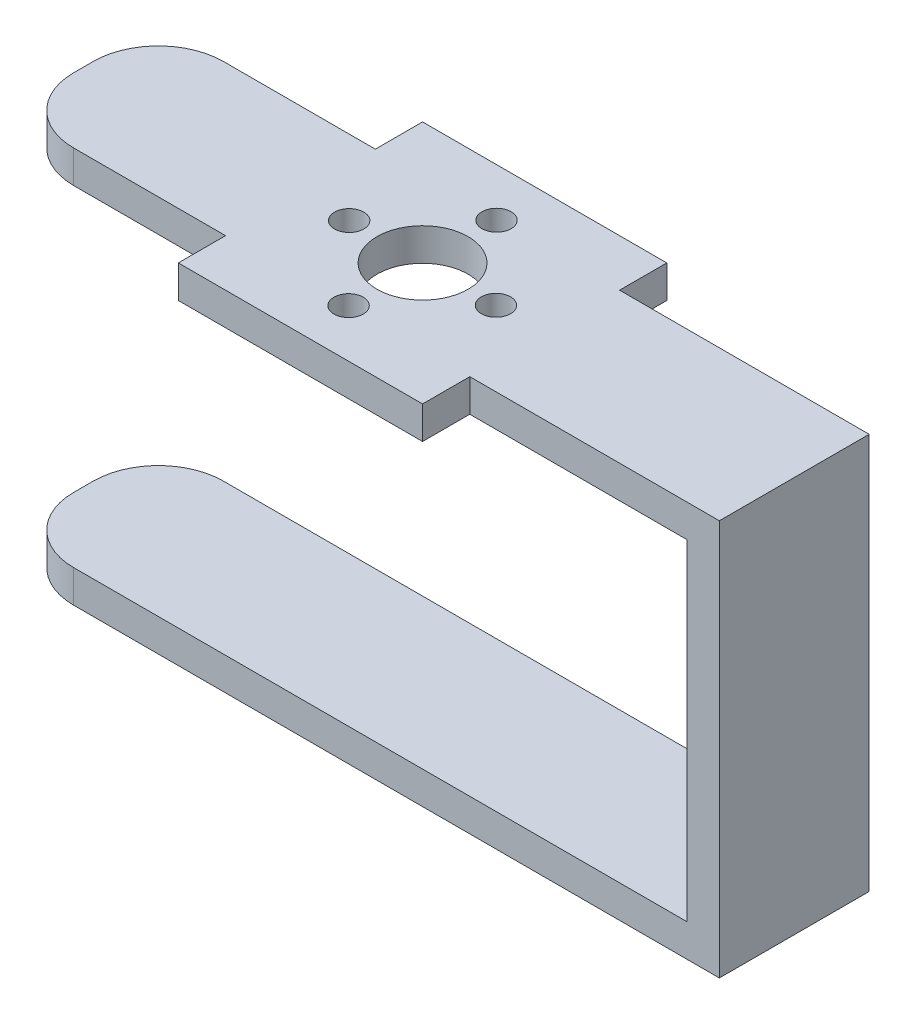
ISO-10303-21;
HEADER;
FILE_DESCRIPTION(('STEP AP214'),'2;1');
FILE_NAME('part.step','',(''),(''),'','','');
FILE_SCHEMA(('AUTOMOTIVE_DESIGN { 1 0 10303 214 1 1 1 1 }'));
ENDSEC;
DATA;
#1=APPLICATION_CONTEXT('core data for automotive mechanical design processes');
#2=APPLICATION_PROTOCOL_DEFINITION('international standard','automotive_design',2000,#1);
#3=PRODUCT_CONTEXT('',#1,'mechanical');
#4=PRODUCT('Part','Part','',(#3));
#5=PRODUCT_RELATED_PRODUCT_CATEGORY('part','',(#4));
#6=PRODUCT_DEFINITION_FORMATION('','',#4);
#7=PRODUCT_DEFINITION_CONTEXT('part definition',#1,'design');
#8=PRODUCT_DEFINITION('design','',#6,#7);
#9=PRODUCT_DEFINITION_SHAPE('','',#8);
#10=(LENGTH_UNIT() NAMED_UNIT(*) SI_UNIT(.MILLI.,.METRE.));
#11=(NAMED_UNIT(*) PLANE_ANGLE_UNIT() SI_UNIT($,.RADIAN.));
#12=(NAMED_UNIT(*) SI_UNIT($,.STERADIAN.) SOLID_ANGLE_UNIT());
#13=UNCERTAINTY_MEASURE_WITH_UNIT(LENGTH_MEASURE(1.E-05),#10,'distance_accuracy_value','');
#14=(GEOMETRIC_REPRESENTATION_CONTEXT(3) GLOBAL_UNCERTAINTY_ASSIGNED_CONTEXT((#13)) GLOBAL_UNIT_ASSIGNED_CONTEXT((#10,
#11,#12)) REPRESENTATION_CONTEXT('',''));
#15=CARTESIAN_POINT('',(0.,0.,0.));
#16=DIRECTION('',(0.,0.,1.));
#17=DIRECTION('',(1.,0.,0.));
#18=AXIS2_PLACEMENT_3D('',#15,#16,#17);
#19=CARTESIAN_POINT('',(52.07,-60.8,0.));
#20=DIRECTION('',(-1.,0.,0.));
#21=DIRECTION('',(0.,0.,1.));
#22=AXIS2_PLACEMENT_3D('',#19,#20,#21);
#23=PLANE('',#22);
#24=DIRECTION('',(0.,1.,0.));
#25=VECTOR('',#24,1.);
#26=CARTESIAN_POINT('',(52.07,-60.8,-11.5));
#27=LINE('',#26,#25);
#28=CARTESIAN_POINT('',(52.07,-55.8,-11.5));
#29=VERTEX_POINT('',#28);
#30=CARTESIAN_POINT('',(52.07,-5.00000000000001,-11.5));
#31=VERTEX_POINT('',#30);
#32=EDGE_CURVE('E194',#29,#31,#27,.T.);
#33=ORIENTED_EDGE('',*,*,#32,.F.);
#34=DIRECTION('',(0.,0.,1.));
#35=VECTOR('',#34,1.);
#36=CARTESIAN_POINT('',(52.07,-55.8,0.));
#37=LINE('',#36,#35);
#38=CARTESIAN_POINT('',(52.07,-55.8,11.5));
#39=VERTEX_POINT('',#38);
#40=EDGE_CURVE('E200',#29,#39,#37,.T.);
#41=ORIENTED_EDGE('',*,*,#40,.T.);
#42=DIRECTION('',(0.,1.,0.));
#43=VECTOR('',#42,1.);
#44=CARTESIAN_POINT('',(52.07,-60.8,11.5));
#45=LINE('',#44,#43);
#46=CARTESIAN_POINT('',(52.07,-5.,11.5));
#47=VERTEX_POINT('',#46);
#48=EDGE_CURVE('E207',#39,#47,#45,.T.);
#49=ORIENTED_EDGE('',*,*,#48,.T.);
#50=DIRECTION('',(0.,0.,1.));
#51=VECTOR('',#50,1.);
#52=CARTESIAN_POINT('',(52.07,-5.,0.));
#53=LINE('',#52,#51);
#54=EDGE_CURVE('E210',#31,#47,#53,.T.);
#55=ORIENTED_EDGE('',*,*,#54,.F.);
#56=EDGE_LOOP('',(#33,#41,#49,#55));
#57=FACE_BOUND('',#56,.T.);
#58=ADVANCED_FACE('F35',(#57),#23,.T.);
#59=CARTESIAN_POINT('',(0.,-5.,11.5));
#60=DIRECTION('',(0.,0.,1.));
#61=DIRECTION('',(1.,0.,0.));
#62=AXIS2_PLACEMENT_3D('',#59,#60,#61);
#63=PLANE('',#62);
#64=DIRECTION('',(-1.,0.,0.));
#65=VECTOR('',#64,1.);
#66=CARTESIAN_POINT('',(57.07,-55.8,11.5));
#67=LINE('',#66,#65);
#68=CARTESIAN_POINT('',(-42.07,-55.8,11.5));
#69=VERTEX_POINT('',#68);
#70=EDGE_CURVE('E406',#39,#69,#67,.T.);
#71=ORIENTED_EDGE('',*,*,#70,.T.);
#72=DIRECTION('',(0.,-1.,0.));
#73=VECTOR('',#72,1.);
#74=CARTESIAN_POINT('',(-42.07,-5.,11.5));
#75=LINE('',#74,#73);
#76=CARTESIAN_POINT('',(-42.07,-60.8,11.5));
#77=VERTEX_POINT('',#76);
#78=EDGE_CURVE('E328',#69,#77,#75,.T.);
#79=ORIENTED_EDGE('',*,*,#78,.T.);
#80=DIRECTION('',(1.,0.,0.));
#81=VECTOR('',#80,1.);
#82=CARTESIAN_POINT('',(0.,-60.8,11.5));
#83=LINE('',#82,#81);
#84=CARTESIAN_POINT('',(57.07,-60.8,11.5));
#85=VERTEX_POINT('',#84);
#86=EDGE_CURVE('E184',#77,#85,#83,.T.);
#87=ORIENTED_EDGE('',*,*,#86,.T.);
#88=DIRECTION('',(0.,1.,0.));
#89=VECTOR('',#88,1.);
#90=CARTESIAN_POINT('',(57.07,-60.8,11.5));
#91=LINE('',#90,#89);
#92=CARTESIAN_POINT('',(57.07,0.,11.5));
#93=VERTEX_POINT('',#92);
#94=EDGE_CURVE('E197',#85,#93,#91,.T.);
#95=ORIENTED_EDGE('',*,*,#94,.T.);
#96=DIRECTION('',(1.,0.,0.));
#97=VECTOR('',#96,1.);
#98=CARTESIAN_POINT('',(0.,0.,11.5));
#99=LINE('',#98,#97);
#100=CARTESIAN_POINT('',(18.75,0.,11.5));
#101=VERTEX_POINT('',#100);
#102=EDGE_CURVE('E277',#101,#93,#99,.T.);
#103=ORIENTED_EDGE('',*,*,#102,.F.);
#104=DIRECTION('',(0.,1.,0.));
#105=VECTOR('',#104,1.);
#106=CARTESIAN_POINT('',(18.75,-5.,11.5));
#107=LINE('',#106,#105);
#108=CARTESIAN_POINT('',(18.75,-5.,11.5));
#109=VERTEX_POINT('',#108);
#110=EDGE_CURVE('E294',#109,#101,#107,.T.);
#111=ORIENTED_EDGE('',*,*,#110,.F.);
#112=DIRECTION('',(1.,0.,0.));
#113=VECTOR('',#112,1.);
#114=CARTESIAN_POINT('',(0.,-5.,11.5));
#115=LINE('',#114,#113);
#116=EDGE_CURVE('E236',#109,#47,#115,.T.);
#117=ORIENTED_EDGE('',*,*,#116,.T.);
#118=ORIENTED_EDGE('',*,*,#48,.F.);
#119=EDGE_LOOP('',(#71,#79,#87,#95,#103,#111,#117,#118));
#120=FACE_BOUND('',#119,.T.);
#121=ADVANCED_FACE('F385',(#120),#63,.T.);
#122=CARTESIAN_POINT('',(18.75,-5.,0.));
#123=DIRECTION('',(1.,0.,0.));
#124=DIRECTION('',(0.,0.,-1.));
#125=AXIS2_PLACEMENT_3D('',#122,#123,#124);
#126=PLANE('',#125);
#127=DIRECTION('',(0.,0.,-1.));
#128=VECTOR('',#127,1.);
#129=CARTESIAN_POINT('',(18.75,0.,0.));
#130=LINE('',#129,#128);
#131=CARTESIAN_POINT('',(18.75,0.,18.75));
#132=VERTEX_POINT('',#131);
#133=EDGE_CURVE('E260',#132,#101,#130,.T.);
#134=ORIENTED_EDGE('',*,*,#133,.F.);
#135=DIRECTION('',(0.,1.,0.));
#136=VECTOR('',#135,1.);
#137=CARTESIAN_POINT('',(18.75,-5.,18.75));
#138=LINE('',#137,#136);
#139=CARTESIAN_POINT('',(18.75,-5.,18.75));
#140=VERTEX_POINT('',#139);
#141=EDGE_CURVE('E297',#140,#132,#138,.T.);
#142=ORIENTED_EDGE('',*,*,#141,.F.);
#143=DIRECTION('',(0.,0.,-1.));
#144=VECTOR('',#143,1.);
#145=CARTESIAN_POINT('',(18.75,-5.,0.));
#146=LINE('',#145,#144);
#147=EDGE_CURVE('E221',#140,#109,#146,.T.);
#148=ORIENTED_EDGE('',*,*,#147,.T.);
#149=ORIENTED_EDGE('',*,*,#110,.T.);
#150=EDGE_LOOP('',(#134,#142,#148,#149));
#151=FACE_BOUND('',#150,.T.);
#152=ADVANCED_FACE('F378',(#151),#126,.T.);
#153=CARTESIAN_POINT('',(0.,-5.,18.75));
#154=DIRECTION('',(0.,0.,-1.));
#155=DIRECTION('',(-1.,0.,0.));
#156=AXIS2_PLACEMENT_3D('',#153,#154,#155);
#157=PLANE('',#156);
#158=DIRECTION('',(-1.,0.,0.));
#159=VECTOR('',#158,1.);
#160=CARTESIAN_POINT('',(0.,0.,18.75));
#161=LINE('',#160,#159);
#162=CARTESIAN_POINT('',(-18.75,0.,18.75));
#163=VERTEX_POINT('',#162);
#164=EDGE_CURVE('E275',#132,#163,#161,.T.);
#165=ORIENTED_EDGE('',*,*,#164,.T.);
#166=DIRECTION('',(0.,1.,0.));
#167=VECTOR('',#166,1.);
#168=CARTESIAN_POINT('',(-18.75,-5.,18.75));
#169=LINE('',#168,#167);
#170=CARTESIAN_POINT('',(-18.75,-5.,18.75));
#171=VERTEX_POINT('',#170);
#172=EDGE_CURVE('E299',#171,#163,#169,.T.);
#173=ORIENTED_EDGE('',*,*,#172,.F.);
#174=DIRECTION('',(-1.,0.,0.));
#175=VECTOR('',#174,1.);
#176=CARTESIAN_POINT('',(0.,-5.,18.75));
#177=LINE('',#176,#175);
#178=EDGE_CURVE('E234',#140,#171,#177,.T.);
#179=ORIENTED_EDGE('',*,*,#178,.F.);
#180=ORIENTED_EDGE('',*,*,#141,.T.);
#181=EDGE_LOOP('',(#165,#173,#179,#180));
#182=FACE_BOUND('',#181,.T.);
#183=ADVANCED_FACE('F474',(#182),#157,.F.);
#184=CARTESIAN_POINT('',(-18.75,-5.,0.));
#185=DIRECTION('',(1.,0.,0.));
#186=DIRECTION('',(0.,0.,-1.));
#187=AXIS2_PLACEMENT_3D('',#184,#185,#186);
#188=PLANE('',#187);
#189=DIRECTION('',(0.,0.,-1.));
#190=VECTOR('',#189,1.);
#191=CARTESIAN_POINT('',(-18.75,0.,0.));
#192=LINE('',#191,#190);
#193=CARTESIAN_POINT('',(-18.75,0.,11.5));
#194=VERTEX_POINT('',#193);
#195=EDGE_CURVE('E267',#163,#194,#192,.T.);
#196=ORIENTED_EDGE('',*,*,#195,.T.);
#197=DIRECTION('',(0.,1.,0.));
#198=VECTOR('',#197,1.);
#199=CARTESIAN_POINT('',(-18.75,-5.,11.5));
#200=LINE('',#199,#198);
#201=CARTESIAN_POINT('',(-18.75,-5.,11.5));
#202=VERTEX_POINT('',#201);
#203=EDGE_CURVE('E302',#202,#194,#200,.T.);
#204=ORIENTED_EDGE('',*,*,#203,.F.);
#205=DIRECTION('',(0.,0.,-1.));
#206=VECTOR('',#205,1.);
#207=CARTESIAN_POINT('',(-18.75,-5.,0.));
#208=LINE('',#207,#206);
#209=EDGE_CURVE('E227',#171,#202,#208,.T.);
#210=ORIENTED_EDGE('',*,*,#209,.F.);
#211=ORIENTED_EDGE('',*,*,#172,.T.);
#212=EDGE_LOOP('',(#196,#204,#210,#211));
#213=FACE_BOUND('',#212,.T.);
#214=ADVANCED_FACE('F370',(#213),#188,.F.);
#215=CARTESIAN_POINT('',(0.,-5.,11.5));
#216=DIRECTION('',(0.,0.,-1.));
#217=DIRECTION('',(-1.,0.,0.));
#218=AXIS2_PLACEMENT_3D('',#215,#216,#217);
#219=PLANE('',#218);
#220=DIRECTION('',(-1.,0.,0.));
#221=VECTOR('',#220,1.);
#222=CARTESIAN_POINT('',(0.,0.,11.5));
#223=LINE('',#222,#221);
#224=CARTESIAN_POINT('',(-42.07,0.,11.5));
#225=VERTEX_POINT('',#224);
#226=EDGE_CURVE('E273',#194,#225,#223,.T.);
#227=ORIENTED_EDGE('',*,*,#226,.T.);
#228=DIRECTION('',(0.,1.,0.));
#229=VECTOR('',#228,1.);
#230=CARTESIAN_POINT('',(-42.07,-5.,11.5));
#231=LINE('',#230,#229);
#232=CARTESIAN_POINT('',(-42.07,-5.,11.5));
#233=VERTEX_POINT('',#232);
#234=EDGE_CURVE('E11',#225,#233,#231,.F.);
#235=ORIENTED_EDGE('',*,*,#234,.T.);
#236=DIRECTION('',(-1.,0.,0.));
#237=VECTOR('',#236,1.);
#238=CARTESIAN_POINT('',(0.,-5.,11.5));
#239=LINE('',#238,#237);
#240=EDGE_CURVE('E232',#202,#233,#239,.T.);
#241=ORIENTED_EDGE('',*,*,#240,.F.);
#242=ORIENTED_EDGE('',*,*,#203,.T.);
#243=EDGE_LOOP('',(#227,#235,#241,#242));
#244=FACE_BOUND('',#243,.T.);
#245=ADVANCED_FACE('F366',(#244),#219,.F.);
#246=CARTESIAN_POINT('',(-52.07,-5.,0.));
#247=DIRECTION('',(-1.,0.,0.));
#248=DIRECTION('',(0.,0.,1.));
#249=AXIS2_PLACEMENT_3D('',#246,#247,#248);
#250=PLANE('',#249);
#251=DIRECTION('',(0.,0.,1.));
#252=VECTOR('',#251,1.);
#253=CARTESIAN_POINT('',(-52.07,0.,0.));
#254=LINE('',#253,#252);
#255=CARTESIAN_POINT('',(-52.07,0.,-1.49999999999999));
#256=VERTEX_POINT('',#255);
#257=CARTESIAN_POINT('',(-52.07,0.,1.49999999999999));
#258=VERTEX_POINT('',#257);
#259=EDGE_CURVE('E270',#256,#258,#254,.T.);
#260=ORIENTED_EDGE('',*,*,#259,.F.);
#261=DIRECTION('',(0.,1.,0.));
#262=VECTOR('',#261,1.);
#263=CARTESIAN_POINT('',(-52.07,-5.,-1.49999999999999));
#264=LINE('',#263,#262);
#265=CARTESIAN_POINT('',(-52.07,-5.,-1.49999999999999));
#266=VERTEX_POINT('',#265);
#267=EDGE_CURVE('E341',#256,#266,#264,.F.);
#268=ORIENTED_EDGE('',*,*,#267,.T.);
#269=DIRECTION('',(0.,0.,1.));
#270=VECTOR('',#269,1.);
#271=CARTESIAN_POINT('',(-52.07,-5.,0.));
#272=LINE('',#271,#270);
#273=CARTESIAN_POINT('',(-52.07,-5.,1.49999999999999));
#274=VERTEX_POINT('',#273);
#275=EDGE_CURVE('E230',#266,#274,#272,.T.);
#276=ORIENTED_EDGE('',*,*,#275,.T.);
#277=DIRECTION('',(0.,1.,0.));
#278=VECTOR('',#277,1.);
#279=CARTESIAN_POINT('',(-52.07,0.,1.49999999999999));
#280=LINE('',#279,#278);
#281=EDGE_CURVE('E338',#274,#258,#280,.T.);
#282=ORIENTED_EDGE('',*,*,#281,.T.);
#283=EDGE_LOOP('',(#260,#268,#276,#282));
#284=FACE_BOUND('',#283,.T.);
#285=ADVANCED_FACE('F361',(#284),#250,.T.);
#286=CARTESIAN_POINT('',(0.,-5.,-11.5));
#287=DIRECTION('',(0.,0.,-1.));
#288=DIRECTION('',(-1.,0.,0.));
#289=AXIS2_PLACEMENT_3D('',#286,#287,#288);
#290=PLANE('',#289);
#291=DIRECTION('',(-1.,0.,0.));
#292=VECTOR('',#291,1.);
#293=CARTESIAN_POINT('',(0.,-5.,-11.5));
#294=LINE('',#293,#292);
#295=CARTESIAN_POINT('',(-18.75,-5.,-11.5));
#296=VERTEX_POINT('',#295);
#297=CARTESIAN_POINT('',(-42.07,-5.,-11.5));
#298=VERTEX_POINT('',#297);
#299=EDGE_CURVE('E226',#296,#298,#294,.T.);
#300=ORIENTED_EDGE('',*,*,#299,.T.);
#301=DIRECTION('',(0.,1.,0.));
#302=VECTOR('',#301,1.);
#303=CARTESIAN_POINT('',(-42.07,-5.,-11.5));
#304=LINE('',#303,#302);
#305=CARTESIAN_POINT('',(-42.07,0.,-11.5));
#306=VERTEX_POINT('',#305);
#307=EDGE_CURVE('E331',#298,#306,#304,.T.);
#308=ORIENTED_EDGE('',*,*,#307,.T.);
#309=DIRECTION('',(-1.,0.,0.));
#310=VECTOR('',#309,1.);
#311=CARTESIAN_POINT('',(0.,0.,-11.5));
#312=LINE('',#311,#310);
#313=CARTESIAN_POINT('',(-18.75,0.,-11.5));
#314=VERTEX_POINT('',#313);
#315=EDGE_CURVE('E266',#314,#306,#312,.T.);
#316=ORIENTED_EDGE('',*,*,#315,.F.);
#317=DIRECTION('',(0.,1.,0.));
#318=VECTOR('',#317,1.);
#319=CARTESIAN_POINT('',(-18.75,-5.,-11.5));
#320=LINE('',#319,#318);
#321=EDGE_CURVE('E305',#296,#314,#320,.T.);
#322=ORIENTED_EDGE('',*,*,#321,.F.);
#323=EDGE_LOOP('',(#300,#308,#316,#322));
#324=FACE_BOUND('',#323,.T.);
#325=ADVANCED_FACE('F351',(#324),#290,.T.);
#326=CARTESIAN_POINT('',(-18.75,0.,-18.75));
#327=VERTEX_POINT('',#326);
#328=EDGE_CURVE('E263',#314,#327,#192,.T.);
#329=ORIENTED_EDGE('',*,*,#328,.T.);
#330=DIRECTION('',(0.,1.,0.));
#331=VECTOR('',#330,1.);
#332=CARTESIAN_POINT('',(-18.75,-5.,-18.75));
#333=LINE('',#332,#331);
#334=CARTESIAN_POINT('',(-18.75,-5.,-18.75));
#335=VERTEX_POINT('',#334);
#336=EDGE_CURVE('E307',#335,#327,#333,.T.);
#337=ORIENTED_EDGE('',*,*,#336,.F.);
#338=EDGE_CURVE('E224',#296,#335,#208,.T.);
#339=ORIENTED_EDGE('',*,*,#338,.F.);
#340=ORIENTED_EDGE('',*,*,#321,.T.);
#341=EDGE_LOOP('',(#329,#337,#339,#340));
#342=FACE_BOUND('',#341,.T.);
#343=ADVANCED_FACE('F398',(#342),#188,.F.);
#344=CARTESIAN_POINT('',(0.,-5.,-18.75));
#345=DIRECTION('',(0.,0.,-1.));
#346=DIRECTION('',(-1.,0.,0.));
#347=AXIS2_PLACEMENT_3D('',#344,#345,#346);
#348=PLANE('',#347);
#349=DIRECTION('',(-1.,0.,0.));
#350=VECTOR('',#349,1.);
#351=CARTESIAN_POINT('',(0.,0.,-18.75));
#352=LINE('',#351,#350);
#353=CARTESIAN_POINT('',(18.75,0.,-18.75));
#354=VERTEX_POINT('',#353);
#355=EDGE_CURVE('E259',#354,#327,#352,.T.);
#356=ORIENTED_EDGE('',*,*,#355,.F.);
#357=DIRECTION('',(0.,1.,0.));
#358=VECTOR('',#357,1.);
#359=CARTESIAN_POINT('',(18.75,-5.,-18.75));
#360=LINE('',#359,#358);
#361=CARTESIAN_POINT('',(18.75,-5.,-18.75));
#362=VERTEX_POINT('',#361);
#363=EDGE_CURVE('E309',#362,#354,#360,.T.);
#364=ORIENTED_EDGE('',*,*,#363,.F.);
#365=DIRECTION('',(-1.,0.,0.));
#366=VECTOR('',#365,1.);
#367=CARTESIAN_POINT('',(0.,-5.,-18.75));
#368=LINE('',#367,#366);
#369=EDGE_CURVE('E220',#362,#335,#368,.T.);
#370=ORIENTED_EDGE('',*,*,#369,.T.);
#371=ORIENTED_EDGE('',*,*,#336,.T.);
#372=EDGE_LOOP('',(#356,#364,#370,#371));
#373=FACE_BOUND('',#372,.T.);
#374=ADVANCED_FACE('F395',(#373),#348,.T.);
#375=CARTESIAN_POINT('',(18.75,0.,-11.5));
#376=VERTEX_POINT('',#375);
#377=EDGE_CURVE('E256',#376,#354,#130,.T.);
#378=ORIENTED_EDGE('',*,*,#377,.F.);
#379=DIRECTION('',(0.,1.,0.));
#380=VECTOR('',#379,1.);
#381=CARTESIAN_POINT('',(18.75,-5.,-11.5));
#382=LINE('',#381,#380);
#383=CARTESIAN_POINT('',(18.75,-5.,-11.5));
#384=VERTEX_POINT('',#383);
#385=EDGE_CURVE('E254',#384,#376,#382,.T.);
#386=ORIENTED_EDGE('',*,*,#385,.F.);
#387=EDGE_CURVE('E217',#384,#362,#146,.T.);
#388=ORIENTED_EDGE('',*,*,#387,.T.);
#389=ORIENTED_EDGE('',*,*,#363,.T.);
#390=EDGE_LOOP('',(#378,#386,#388,#389));
#391=FACE_BOUND('',#390,.T.);
#392=ADVANCED_FACE('F389',(#391),#126,.T.);
#393=CARTESIAN_POINT('',(0.,-5.,-11.358));
#394=DIRECTION('',(0.,1.,0.));
#395=DIRECTION('',(0.,0.,1.));
#396=AXIS2_PLACEMENT_3D('',#393,#394,#395);
#397=CYLINDRICAL_SURFACE('',#396,2.25);
#398=CARTESIAN_POINT('',(0.,-5.,-11.358));
#399=DIRECTION('',(0.,1.,0.));
#400=DIRECTION('',(0.,0.,1.));
#401=AXIS2_PLACEMENT_3D('',#398,#399,#400);
#402=CIRCLE('',#401,2.25);
#403=CARTESIAN_POINT('',(0.,-5.,-9.108));
#404=VERTEX_POINT('',#403);
#405=EDGE_CURVE('E248',#404,#404,#402,.T.);
#406=ORIENTED_EDGE('',*,*,#405,.F.);
#407=EDGE_LOOP('',(#406));
#408=FACE_BOUND('',#407,.T.);
#409=CARTESIAN_POINT('',(0.,0.,-11.358));
#410=DIRECTION('',(0.,1.,0.));
#411=DIRECTION('',(0.,0.,1.));
#412=AXIS2_PLACEMENT_3D('',#409,#410,#411);
#413=CIRCLE('',#412,2.25);
#414=CARTESIAN_POINT('',(0.,0.,-9.108));
#415=VERTEX_POINT('',#414);
#416=EDGE_CURVE('E289',#415,#415,#413,.T.);
#417=ORIENTED_EDGE('',*,*,#416,.T.);
#418=EDGE_LOOP('',(#417));
#419=FACE_BOUND('',#418,.T.);
#420=ADVANCED_FACE('F456',(#408,#419),#397,.F.);
#421=CARTESIAN_POINT('',(11.269242920445,-5.,0.));
#422=DIRECTION('',(0.,1.,0.));
#423=DIRECTION('',(0.,0.,1.));
#424=AXIS2_PLACEMENT_3D('',#421,#422,#423);
#425=CYLINDRICAL_SURFACE('',#424,2.25);
#426=CARTESIAN_POINT('',(11.269242920445,-5.,0.));
#427=DIRECTION('',(0.,1.,0.));
#428=DIRECTION('',(0.,0.,1.));
#429=AXIS2_PLACEMENT_3D('',#426,#427,#428);
#430=CIRCLE('',#429,2.25);
#431=CARTESIAN_POINT('',(11.269242920445,-5.,2.25));
#432=VERTEX_POINT('',#431);
#433=EDGE_CURVE('E245',#432,#432,#430,.T.);
#434=ORIENTED_EDGE('',*,*,#433,.F.);
#435=EDGE_LOOP('',(#434));
#436=FACE_BOUND('',#435,.T.);
#437=CARTESIAN_POINT('',(11.269242920445,0.,0.));
#438=DIRECTION('',(0.,1.,0.));
#439=DIRECTION('',(0.,0.,1.));
#440=AXIS2_PLACEMENT_3D('',#437,#438,#439);
#441=CIRCLE('',#440,2.25);
#442=CARTESIAN_POINT('',(11.269242920445,0.,2.25));
#443=VERTEX_POINT('',#442);
#444=EDGE_CURVE('E286',#443,#443,#441,.T.);
#445=ORIENTED_EDGE('',*,*,#444,.T.);
#446=EDGE_LOOP('',(#445));
#447=FACE_BOUND('',#446,.T.);
#448=ADVANCED_FACE('F459',(#436,#447),#425,.F.);
#449=CARTESIAN_POINT('',(-11.269242920445,-5.,0.));
#450=DIRECTION('',(0.,1.,0.));
#451=DIRECTION('',(0.,0.,1.));
#452=AXIS2_PLACEMENT_3D('',#449,#450,#451);
#453=CYLINDRICAL_SURFACE('',#452,2.25);
#454=CARTESIAN_POINT('',(-11.269242920445,-5.,0.));
#455=DIRECTION('',(0.,1.,0.));
#456=DIRECTION('',(0.,0.,1.));
#457=AXIS2_PLACEMENT_3D('',#454,#455,#456);
#458=CIRCLE('',#457,2.25);
#459=CARTESIAN_POINT('',(-11.269242920445,-5.,2.25));
#460=VERTEX_POINT('',#459);
#461=EDGE_CURVE('E242',#460,#460,#458,.T.);
#462=ORIENTED_EDGE('',*,*,#461,.F.);
#463=EDGE_LOOP('',(#462));
#464=FACE_BOUND('',#463,.T.);
#465=CARTESIAN_POINT('',(-11.269242920445,0.,0.));
#466=DIRECTION('',(0.,1.,0.));
#467=DIRECTION('',(0.,0.,1.));
#468=AXIS2_PLACEMENT_3D('',#465,#466,#467);
#469=CIRCLE('',#468,2.25);
#470=CARTESIAN_POINT('',(-11.269242920445,0.,2.25));
#471=VERTEX_POINT('',#470);
#472=EDGE_CURVE('E283',#471,#471,#469,.T.);
#473=ORIENTED_EDGE('',*,*,#472,.T.);
#474=EDGE_LOOP('',(#473));
#475=FACE_BOUND('',#474,.T.);
#476=ADVANCED_FACE('F463',(#464,#475),#453,.F.);
#477=CARTESIAN_POINT('',(0.,-5.,11.358));
#478=DIRECTION('',(0.,1.,0.));
#479=DIRECTION('',(0.,0.,1.));
#480=AXIS2_PLACEMENT_3D('',#477,#478,#479);
#481=CYLINDRICAL_SURFACE('',#480,2.25);
#482=CARTESIAN_POINT('',(0.,-5.,11.358));
#483=DIRECTION('',(0.,1.,0.));
#484=DIRECTION('',(0.,0.,1.));
#485=AXIS2_PLACEMENT_3D('',#482,#483,#484);
#486=CIRCLE('',#485,2.25);
#487=CARTESIAN_POINT('',(0.,-5.,13.608));
#488=VERTEX_POINT('',#487);
#489=EDGE_CURVE('E239',#488,#488,#486,.T.);
#490=ORIENTED_EDGE('',*,*,#489,.F.);
#491=EDGE_LOOP('',(#490));
#492=FACE_BOUND('',#491,.T.);
#493=CARTESIAN_POINT('',(0.,0.,11.358));
#494=DIRECTION('',(0.,1.,0.));
#495=DIRECTION('',(0.,0.,1.));
#496=AXIS2_PLACEMENT_3D('',#493,#494,#495);
#497=CIRCLE('',#496,2.25);
#498=CARTESIAN_POINT('',(0.,0.,13.608));
#499=VERTEX_POINT('',#498);
#500=EDGE_CURVE('E280',#499,#499,#497,.T.);
#501=ORIENTED_EDGE('',*,*,#500,.T.);
#502=EDGE_LOOP('',(#501));
#503=FACE_BOUND('',#502,.T.);
#504=ADVANCED_FACE('F467',(#492,#503),#481,.F.);
#505=CARTESIAN_POINT('',(0.,-5.,-11.5));
#506=DIRECTION('',(0.,0.,1.));
#507=DIRECTION('',(1.,0.,0.));
#508=AXIS2_PLACEMENT_3D('',#505,#506,#507);
#509=PLANE('',#508);
#510=DIRECTION('',(1.,0.,0.));
#511=VECTOR('',#510,1.);
#512=CARTESIAN_POINT('',(0.,-60.8,-11.5));
#513=LINE('',#512,#511);
#514=CARTESIAN_POINT('',(-42.07,-60.8,-11.5));
#515=VERTEX_POINT('',#514);
#516=CARTESIAN_POINT('',(57.07,-60.8,-11.5));
#517=VERTEX_POINT('',#516);
#518=EDGE_CURVE('E173',#515,#517,#513,.T.);
#519=ORIENTED_EDGE('',*,*,#518,.F.);
#520=DIRECTION('',(0.,-1.,0.));
#521=VECTOR('',#520,1.);
#522=CARTESIAN_POINT('',(-42.07,-55.8,-11.5));
#523=LINE('',#522,#521);
#524=CARTESIAN_POINT('',(-42.07,-55.8,-11.5));
#525=VERTEX_POINT('',#524);
#526=EDGE_CURVE('E322',#515,#525,#523,.F.);
#527=ORIENTED_EDGE('',*,*,#526,.T.);
#528=DIRECTION('',(1.,0.,0.));
#529=VECTOR('',#528,1.);
#530=CARTESIAN_POINT('',(57.07,-55.8,-11.5));
#531=LINE('',#530,#529);
#532=EDGE_CURVE('E402',#525,#29,#531,.T.);
#533=ORIENTED_EDGE('',*,*,#532,.T.);
#534=ORIENTED_EDGE('',*,*,#32,.T.);
#535=DIRECTION('',(1.,0.,0.));
#536=VECTOR('',#535,1.);
#537=CARTESIAN_POINT('',(0.,-5.,-11.5));
#538=LINE('',#537,#536);
#539=EDGE_CURVE('E213',#384,#31,#538,.T.);
#540=ORIENTED_EDGE('',*,*,#539,.F.);
#541=ORIENTED_EDGE('',*,*,#385,.T.);
#542=DIRECTION('',(1.,0.,0.));
#543=VECTOR('',#542,1.);
#544=CARTESIAN_POINT('',(0.,0.,-11.5));
#545=LINE('',#544,#543);
#546=CARTESIAN_POINT('',(57.07,0.,-11.5));
#547=VERTEX_POINT('',#546);
#548=EDGE_CURVE('E190',#376,#547,#545,.T.);
#549=ORIENTED_EDGE('',*,*,#548,.T.);
#550=DIRECTION('',(0.,1.,0.));
#551=VECTOR('',#550,1.);
#552=CARTESIAN_POINT('',(57.07,-60.8,-11.5));
#553=LINE('',#552,#551);
#554=EDGE_CURVE('E187',#517,#547,#553,.T.);
#555=ORIENTED_EDGE('',*,*,#554,.F.);
#556=EDGE_LOOP('',(#519,#527,#533,#534,#540,#541,#549,#555));
#557=FACE_BOUND('',#556,.T.);
#558=ADVANCED_FACE('F188',(#557),#509,.F.);
#559=CARTESIAN_POINT('',(0.,-5.,0.));
#560=DIRECTION('',(0.,1.,0.));
#561=DIRECTION('',(0.,0.,1.));
#562=AXIS2_PLACEMENT_3D('',#559,#560,#561);
#563=CYLINDRICAL_SURFACE('',#562,7.);
#564=CARTESIAN_POINT('',(0.,-5.,0.));
#565=DIRECTION('',(0.,1.,0.));
#566=DIRECTION('',(0.,0.,1.));
#567=AXIS2_PLACEMENT_3D('',#564,#565,#566);
#568=CIRCLE('',#567,7.);
#569=CARTESIAN_POINT('',(0.,-5.,7.));
#570=VERTEX_POINT('',#569);
#571=EDGE_CURVE('E251',#570,#570,#568,.T.);
#572=ORIENTED_EDGE('',*,*,#571,.F.);
#573=EDGE_LOOP('',(#572));
#574=FACE_BOUND('',#573,.T.);
#575=CARTESIAN_POINT('',(0.,0.,0.));
#576=DIRECTION('',(0.,1.,0.));
#577=DIRECTION('',(0.,0.,1.));
#578=AXIS2_PLACEMENT_3D('',#575,#576,#577);
#579=CIRCLE('',#578,7.);
#580=CARTESIAN_POINT('',(0.,0.,7.));
#581=VERTEX_POINT('',#580);
#582=EDGE_CURVE('E214',#581,#581,#579,.T.);
#583=ORIENTED_EDGE('',*,*,#582,.T.);
#584=EDGE_LOOP('',(#583));
#585=FACE_BOUND('',#584,.T.);
#586=ADVANCED_FACE('F450',(#574,#585),#563,.F.);
#587=CARTESIAN_POINT('',(0.,-5.,0.));
#588=DIRECTION('',(0.,1.,0.));
#589=DIRECTION('',(0.,0.,1.));
#590=AXIS2_PLACEMENT_3D('',#587,#588,#589);
#591=PLANE('',#590);
#592=ORIENTED_EDGE('',*,*,#275,.F.);
#593=CARTESIAN_POINT('',(-42.07,-5.,-1.49999999999999));
#594=DIRECTION('',(0.,1.,0.));
#595=DIRECTION('',(0.,0.,1.));
#596=AXIS2_PLACEMENT_3D('',#593,#594,#595);
#597=CIRCLE('',#596,10.);
#598=EDGE_CURVE('E43',#266,#298,#597,.F.);
#599=ORIENTED_EDGE('',*,*,#598,.T.);
#600=ORIENTED_EDGE('',*,*,#299,.F.);
#601=ORIENTED_EDGE('',*,*,#338,.T.);
#602=ORIENTED_EDGE('',*,*,#369,.F.);
#603=ORIENTED_EDGE('',*,*,#387,.F.);
#604=ORIENTED_EDGE('',*,*,#539,.T.);
#605=ORIENTED_EDGE('',*,*,#54,.T.);
#606=ORIENTED_EDGE('',*,*,#116,.F.);
#607=ORIENTED_EDGE('',*,*,#147,.F.);
#608=ORIENTED_EDGE('',*,*,#178,.T.);
#609=ORIENTED_EDGE('',*,*,#209,.T.);
#610=ORIENTED_EDGE('',*,*,#240,.T.);
#611=CARTESIAN_POINT('',(-42.07,-5.,1.49999999999999));
#612=DIRECTION('',(0.,1.,0.));
#613=DIRECTION('',(0.,0.,1.));
#614=AXIS2_PLACEMENT_3D('',#611,#612,#613);
#615=CIRCLE('',#614,10.);
#616=EDGE_CURVE('E55',#233,#274,#615,.F.);
#617=ORIENTED_EDGE('',*,*,#616,.T.);
#618=EDGE_LOOP('',(#592,#599,#600,#601,#602,#603,#604,#605,#606,#607,#608,#609,#610,#617));
#619=FACE_BOUND('',#618,.T.);
#620=ORIENTED_EDGE('',*,*,#489,.T.);
#621=EDGE_LOOP('',(#620));
#622=FACE_BOUND('',#621,.T.);
#623=ORIENTED_EDGE('',*,*,#461,.T.);
#624=EDGE_LOOP('',(#623));
#625=FACE_BOUND('',#624,.T.);
#626=ORIENTED_EDGE('',*,*,#433,.T.);
#627=EDGE_LOOP('',(#626));
#628=FACE_BOUND('',#627,.T.);
#629=ORIENTED_EDGE('',*,*,#405,.T.);
#630=EDGE_LOOP('',(#629));
#631=FACE_BOUND('',#630,.T.);
#632=ORIENTED_EDGE('',*,*,#571,.T.);
#633=EDGE_LOOP('',(#632));
#634=FACE_BOUND('',#633,.T.);
#635=ADVANCED_FACE('F345',(#619,#622,#625,#628,#631,#634),#591,.F.);
#636=CARTESIAN_POINT('',(0.,0.,0.));
#637=DIRECTION('',(0.,1.,0.));
#638=DIRECTION('',(0.,0.,1.));
#639=AXIS2_PLACEMENT_3D('',#636,#637,#638);
#640=PLANE('',#639);
#641=ORIENTED_EDGE('',*,*,#315,.T.);
#642=CARTESIAN_POINT('',(-42.07,0.,-1.49999999999999));
#643=DIRECTION('',(0.,1.,0.));
#644=DIRECTION('',(0.,0.,1.));
#645=AXIS2_PLACEMENT_3D('',#642,#643,#644);
#646=CIRCLE('',#645,10.);
#647=EDGE_CURVE('E336',#306,#256,#646,.T.);
#648=ORIENTED_EDGE('',*,*,#647,.T.);
#649=ORIENTED_EDGE('',*,*,#259,.T.);
#650=CARTESIAN_POINT('',(-42.07,0.,1.49999999999999));
#651=DIRECTION('',(0.,1.,0.));
#652=DIRECTION('',(0.,0.,1.));
#653=AXIS2_PLACEMENT_3D('',#650,#651,#652);
#654=CIRCLE('',#653,10.);
#655=EDGE_CURVE('E334',#258,#225,#654,.T.);
#656=ORIENTED_EDGE('',*,*,#655,.T.);
#657=ORIENTED_EDGE('',*,*,#226,.F.);
#658=ORIENTED_EDGE('',*,*,#195,.F.);
#659=ORIENTED_EDGE('',*,*,#164,.F.);
#660=ORIENTED_EDGE('',*,*,#133,.T.);
#661=ORIENTED_EDGE('',*,*,#102,.T.);
#662=DIRECTION('',(0.,0.,1.));
#663=VECTOR('',#662,1.);
#664=CARTESIAN_POINT('',(57.07,0.,0.));
#665=LINE('',#664,#663);
#666=EDGE_CURVE('E198',#547,#93,#665,.T.);
#667=ORIENTED_EDGE('',*,*,#666,.F.);
#668=ORIENTED_EDGE('',*,*,#548,.F.);
#669=ORIENTED_EDGE('',*,*,#377,.T.);
#670=ORIENTED_EDGE('',*,*,#355,.T.);
#671=ORIENTED_EDGE('',*,*,#328,.F.);
#672=EDGE_LOOP('',(#641,#648,#649,#656,#657,#658,#659,#660,#661,#667,#668,#669,#670,#671));
#673=FACE_BOUND('',#672,.T.);
#674=ORIENTED_EDGE('',*,*,#500,.F.);
#675=EDGE_LOOP('',(#674));
#676=FACE_BOUND('',#675,.T.);
#677=ORIENTED_EDGE('',*,*,#472,.F.);
#678=EDGE_LOOP('',(#677));
#679=FACE_BOUND('',#678,.T.);
#680=ORIENTED_EDGE('',*,*,#444,.F.);
#681=EDGE_LOOP('',(#680));
#682=FACE_BOUND('',#681,.T.);
#683=ORIENTED_EDGE('',*,*,#416,.F.);
#684=EDGE_LOOP('',(#683));
#685=FACE_BOUND('',#684,.T.);
#686=ORIENTED_EDGE('',*,*,#582,.F.);
#687=EDGE_LOOP('',(#686));
#688=FACE_BOUND('',#687,.T.);
#689=ADVANCED_FACE('F357',(#673,#676,#679,#682,#685,#688),#640,.T.);
#690=CARTESIAN_POINT('',(57.07,-60.8,0.));
#691=DIRECTION('',(-1.,0.,0.));
#692=DIRECTION('',(0.,0.,1.));
#693=AXIS2_PLACEMENT_3D('',#690,#691,#692);
#694=PLANE('',#693);
#695=ORIENTED_EDGE('',*,*,#554,.T.);
#696=ORIENTED_EDGE('',*,*,#666,.T.);
#697=ORIENTED_EDGE('',*,*,#94,.F.);
#698=DIRECTION('',(0.,0.,1.));
#699=VECTOR('',#698,1.);
#700=CARTESIAN_POINT('',(57.07,-60.8,0.));
#701=LINE('',#700,#699);
#702=EDGE_CURVE('E179',#517,#85,#701,.T.);
#703=ORIENTED_EDGE('',*,*,#702,.F.);
#704=EDGE_LOOP('',(#695,#696,#697,#703));
#705=FACE_BOUND('',#704,.T.);
#706=ADVANCED_FACE('F196',(#705),#694,.F.);
#707=CARTESIAN_POINT('',(0.,-60.8,0.));
#708=DIRECTION('',(0.,1.,0.));
#709=DIRECTION('',(0.,0.,1.));
#710=AXIS2_PLACEMENT_3D('',#707,#708,#709);
#711=PLANE('',#710);
#712=CARTESIAN_POINT('',(0.,-60.8,0.));
#713=DIRECTION('',(0.,1.,0.));
#714=DIRECTION('',(0.,0.,1.));
#715=AXIS2_PLACEMENT_3D('',#712,#713,#714);
#716=CIRCLE('',#715,3.);
#717=CARTESIAN_POINT('',(0.,-60.8,3.));
#718=VERTEX_POINT('',#717);
#719=EDGE_CURVE('E296',#718,#718,#716,.F.);
#720=ORIENTED_EDGE('',*,*,#719,.F.);
#721=EDGE_LOOP('',(#720));
#722=FACE_BOUND('',#721,.T.);
#723=DIRECTION('',(0.,0.,-1.));
#724=VECTOR('',#723,1.);
#725=CARTESIAN_POINT('',(-52.07,-60.8,-11.5));
#726=LINE('',#725,#724);
#727=CARTESIAN_POINT('',(-52.07,-60.8,1.5));
#728=VERTEX_POINT('',#727);
#729=CARTESIAN_POINT('',(-52.07,-60.8,-1.50000000000002));
#730=VERTEX_POINT('',#729);
#731=EDGE_CURVE('E413',#728,#730,#726,.T.);
#732=ORIENTED_EDGE('',*,*,#731,.T.);
#733=CARTESIAN_POINT('',(-42.07,-60.8,-1.50000000000002));
#734=DIRECTION('',(0.,1.,0.));
#735=DIRECTION('',(0.,0.,1.));
#736=AXIS2_PLACEMENT_3D('',#733,#734,#735);
#737=CIRCLE('',#736,10.);
#738=EDGE_CURVE('E181',#730,#515,#737,.F.);
#739=ORIENTED_EDGE('',*,*,#738,.T.);
#740=ORIENTED_EDGE('',*,*,#518,.T.);
#741=ORIENTED_EDGE('',*,*,#702,.T.);
#742=ORIENTED_EDGE('',*,*,#86,.F.);
#743=CARTESIAN_POINT('',(-42.07,-60.8,1.5));
#744=DIRECTION('',(0.,1.,0.));
#745=DIRECTION('',(0.,0.,1.));
#746=AXIS2_PLACEMENT_3D('',#743,#744,#745);
#747=CIRCLE('',#746,10.);
#748=EDGE_CURVE('E319',#77,#728,#747,.F.);
#749=ORIENTED_EDGE('',*,*,#748,.T.);
#750=EDGE_LOOP('',(#732,#739,#740,#741,#742,#749));
#751=FACE_BOUND('',#750,.T.);
#752=ADVANCED_FACE('F176',(#722,#751),#711,.F.);
#753=CARTESIAN_POINT('',(-52.07,-55.8,-11.5));
#754=DIRECTION('',(-1.,0.,0.));
#755=DIRECTION('',(0.,0.,1.));
#756=AXIS2_PLACEMENT_3D('',#753,#754,#755);
#757=PLANE('',#756);
#758=DIRECTION('',(0.,0.,-1.));
#759=VECTOR('',#758,1.);
#760=CARTESIAN_POINT('',(-52.07,-55.8,-11.5));
#761=LINE('',#760,#759);
#762=CARTESIAN_POINT('',(-52.07,-55.8,1.5));
#763=VERTEX_POINT('',#762);
#764=CARTESIAN_POINT('',(-52.07,-55.8,-1.50000000000002));
#765=VERTEX_POINT('',#764);
#766=EDGE_CURVE('E412',#763,#765,#761,.T.);
#767=ORIENTED_EDGE('',*,*,#766,.T.);
#768=DIRECTION('',(0.,-1.,0.));
#769=VECTOR('',#768,1.);
#770=CARTESIAN_POINT('',(-52.07,-60.8,-1.50000000000002));
#771=LINE('',#770,#769);
#772=EDGE_CURVE('E316',#765,#730,#771,.T.);
#773=ORIENTED_EDGE('',*,*,#772,.T.);
#774=ORIENTED_EDGE('',*,*,#731,.F.);
#775=DIRECTION('',(0.,-1.,0.));
#776=VECTOR('',#775,1.);
#777=CARTESIAN_POINT('',(-52.07,-55.8,1.5));
#778=LINE('',#777,#776);
#779=EDGE_CURVE('E314',#728,#763,#778,.F.);
#780=ORIENTED_EDGE('',*,*,#779,.T.);
#781=EDGE_LOOP('',(#767,#773,#774,#780));
#782=FACE_BOUND('',#781,.T.);
#783=ADVANCED_FACE('F432',(#782),#757,.T.);
#784=CARTESIAN_POINT('',(0.,-55.8,0.));
#785=DIRECTION('',(0.,-1.,0.));
#786=DIRECTION('',(0.,0.,-1.));
#787=AXIS2_PLACEMENT_3D('',#784,#785,#786);
#788=PLANE('',#787);
#789=ORIENTED_EDGE('',*,*,#532,.F.);
#790=CARTESIAN_POINT('',(-42.07,-55.8,-1.50000000000002));
#791=DIRECTION('',(0.,-1.,0.));
#792=DIRECTION('',(0.,0.,-1.));
#793=AXIS2_PLACEMENT_3D('',#790,#791,#792);
#794=CIRCLE('',#793,10.);
#795=EDGE_CURVE('E326',#525,#765,#794,.F.);
#796=ORIENTED_EDGE('',*,*,#795,.T.);
#797=ORIENTED_EDGE('',*,*,#766,.F.);
#798=CARTESIAN_POINT('',(-42.07,-55.8,1.5));
#799=DIRECTION('',(0.,-1.,0.));
#800=DIRECTION('',(0.,0.,-1.));
#801=AXIS2_PLACEMENT_3D('',#798,#799,#800);
#802=CIRCLE('',#801,10.);
#803=EDGE_CURVE('E324',#763,#69,#802,.F.);
#804=ORIENTED_EDGE('',*,*,#803,.T.);
#805=ORIENTED_EDGE('',*,*,#70,.F.);
#806=ORIENTED_EDGE('',*,*,#40,.F.);
#807=EDGE_LOOP('',(#789,#796,#797,#804,#805,#806));
#808=FACE_BOUND('',#807,.T.);
#809=ADVANCED_FACE('F409',(#808),#788,.F.);
#810=CARTESIAN_POINT('',(0.,-65.8,0.));
#811=DIRECTION('',(0.,1.,0.));
#812=DIRECTION('',(0.,0.,1.));
#813=AXIS2_PLACEMENT_3D('',#810,#811,#812);
#814=CYLINDRICAL_SURFACE('',#813,3.);
#815=CARTESIAN_POINT('',(0.,-65.8,0.));
#816=DIRECTION('',(0.,-1.,0.));
#817=DIRECTION('',(0.,0.,-1.));
#818=AXIS2_PLACEMENT_3D('',#815,#816,#817);
#819=CIRCLE('',#818,3.);
#820=CARTESIAN_POINT('',(0.,-65.8,-3.));
#821=VERTEX_POINT('',#820);
#822=EDGE_CURVE('E417',#821,#821,#819,.T.);
#823=ORIENTED_EDGE('',*,*,#822,.F.);
#824=EDGE_LOOP('',(#823));
#825=FACE_BOUND('',#824,.T.);
#826=ORIENTED_EDGE('',*,*,#719,.T.);
#827=EDGE_LOOP('',(#826));
#828=FACE_BOUND('',#827,.T.);
#829=ADVANCED_FACE('F425',(#825,#828),#814,.T.);
#830=CARTESIAN_POINT('',(0.,-65.8,0.));
#831=DIRECTION('',(0.,-1.,0.));
#832=DIRECTION('',(0.,0.,-1.));
#833=AXIS2_PLACEMENT_3D('',#830,#831,#832);
#834=PLANE('',#833);
#835=ORIENTED_EDGE('',*,*,#822,.T.);
#836=EDGE_LOOP('',(#835));
#837=FACE_BOUND('',#836,.T.);
#838=ADVANCED_FACE('F423',(#837),#834,.T.);
#839=CARTESIAN_POINT('',(-42.07,-55.8,-1.50000000000002));
#840=DIRECTION('',(0.,1.,0.));
#841=DIRECTION('',(0.,0.,1.));
#842=AXIS2_PLACEMENT_3D('',#839,#840,#841);
#843=CYLINDRICAL_SURFACE('',#842,10.);
#844=ORIENTED_EDGE('',*,*,#795,.F.);
#845=ORIENTED_EDGE('',*,*,#526,.F.);
#846=ORIENTED_EDGE('',*,*,#738,.F.);
#847=ORIENTED_EDGE('',*,*,#772,.F.);
#848=EDGE_LOOP('',(#844,#845,#846,#847));
#849=FACE_BOUND('',#848,.T.);
#850=ADVANCED_FACE('F489',(#849),#843,.T.);
#851=CARTESIAN_POINT('',(-42.07,-5.,1.5));
#852=DIRECTION('',(0.,-1.,0.));
#853=DIRECTION('',(0.,0.,-1.));
#854=AXIS2_PLACEMENT_3D('',#851,#852,#853);
#855=CYLINDRICAL_SURFACE('',#854,10.);
#856=ORIENTED_EDGE('',*,*,#803,.F.);
#857=ORIENTED_EDGE('',*,*,#779,.F.);
#858=ORIENTED_EDGE('',*,*,#748,.F.);
#859=ORIENTED_EDGE('',*,*,#78,.F.);
#860=EDGE_LOOP('',(#856,#857,#858,#859));
#861=FACE_BOUND('',#860,.T.);
#862=ADVANCED_FACE('F492',(#861),#855,.T.);
#863=CARTESIAN_POINT('',(-42.07,-5.,-1.49999999999999));
#864=DIRECTION('',(0.,1.,0.));
#865=DIRECTION('',(0.,0.,1.));
#866=AXIS2_PLACEMENT_3D('',#863,#864,#865);
#867=CYLINDRICAL_SURFACE('',#866,10.);
#868=ORIENTED_EDGE('',*,*,#598,.F.);
#869=ORIENTED_EDGE('',*,*,#267,.F.);
#870=ORIENTED_EDGE('',*,*,#647,.F.);
#871=ORIENTED_EDGE('',*,*,#307,.F.);
#872=EDGE_LOOP('',(#868,#869,#870,#871));
#873=FACE_BOUND('',#872,.T.);
#874=ADVANCED_FACE('F354',(#873),#867,.T.);
#875=CARTESIAN_POINT('',(-42.07,-5.,1.49999999999999));
#876=DIRECTION('',(0.,-1.,0.));
#877=DIRECTION('',(0.,0.,-1.));
#878=AXIS2_PLACEMENT_3D('',#875,#876,#877);
#879=CYLINDRICAL_SURFACE('',#878,10.);
#880=ORIENTED_EDGE('',*,*,#616,.F.);
#881=ORIENTED_EDGE('',*,*,#234,.F.);
#882=ORIENTED_EDGE('',*,*,#655,.F.);
#883=ORIENTED_EDGE('',*,*,#281,.F.);
#884=EDGE_LOOP('',(#880,#881,#882,#883));
#885=FACE_BOUND('',#884,.T.);
#886=ADVANCED_FACE('F37',(#885),#879,.T.);
#887=CLOSED_SHELL('',(#58,#121,#152,#183,#214,#245,#285,#325,#343,#374,#392,#420,#448,#476,#504,
#558,#586,#635,#689,#706,#752,#783,#809,#829,#838,#850,#862,#874,#886));
#888=MANIFOLD_SOLID_BREP('B2',#887);
#889=ADVANCED_BREP_SHAPE_REPRESENTATION('',(#18,#888),#14);
#890=SHAPE_DEFINITION_REPRESENTATION(#9,#889);
ENDSEC;
END-ISO-10303-21;
